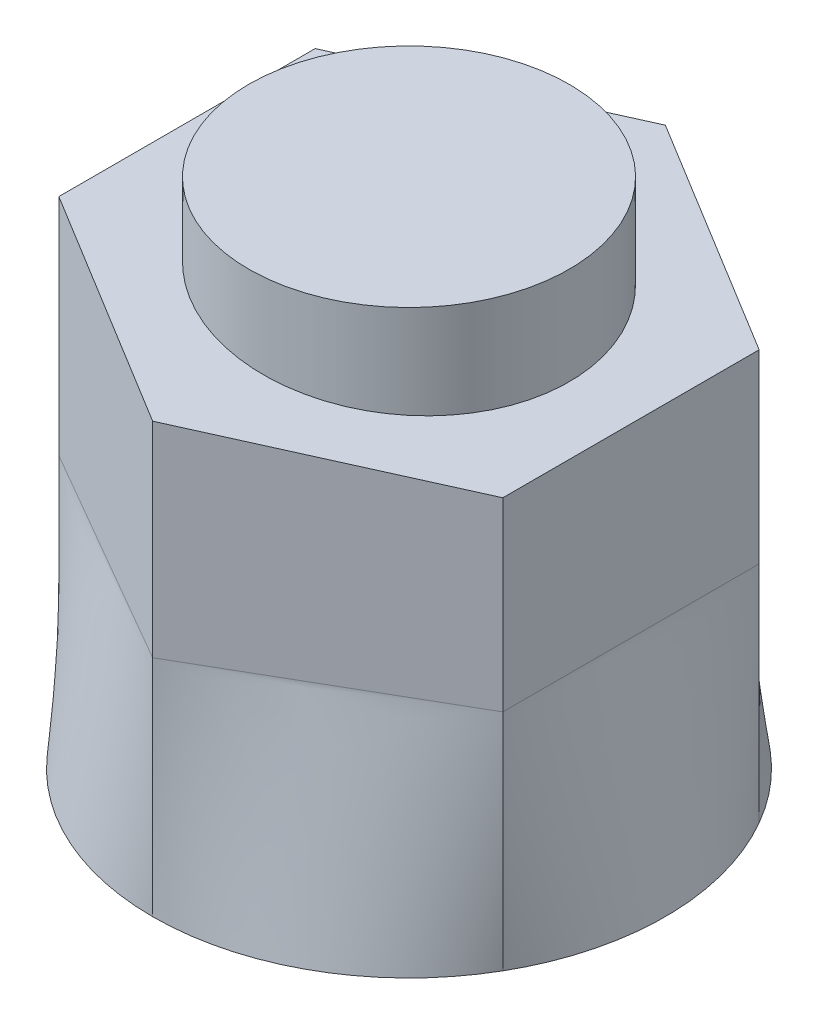
ISO-10303-21;
HEADER;
FILE_DESCRIPTION(('STEP AP214'),'2;1');
FILE_NAME('part.step','',(''),(''),'','','');
FILE_SCHEMA(('AUTOMOTIVE_DESIGN { 1 0 10303 214 1 1 1 1 }'));
ENDSEC;
DATA;
#1=APPLICATION_CONTEXT('core data for automotive mechanical design processes');
#2=APPLICATION_PROTOCOL_DEFINITION('international standard','automotive_design',2000,#1);
#3=PRODUCT_CONTEXT('',#1,'mechanical');
#4=PRODUCT('Part','Part','',(#3));
#5=PRODUCT_RELATED_PRODUCT_CATEGORY('part','',(#4));
#6=PRODUCT_DEFINITION_FORMATION('','',#4);
#7=PRODUCT_DEFINITION_CONTEXT('part definition',#1,'design');
#8=PRODUCT_DEFINITION('design','',#6,#7);
#9=PRODUCT_DEFINITION_SHAPE('','',#8);
#10=(LENGTH_UNIT() NAMED_UNIT(*) SI_UNIT(.MILLI.,.METRE.));
#11=(NAMED_UNIT(*) PLANE_ANGLE_UNIT() SI_UNIT($,.RADIAN.));
#12=(NAMED_UNIT(*) SI_UNIT($,.STERADIAN.) SOLID_ANGLE_UNIT());
#13=UNCERTAINTY_MEASURE_WITH_UNIT(LENGTH_MEASURE(1.E-05),#10,'distance_accuracy_value','');
#14=(GEOMETRIC_REPRESENTATION_CONTEXT(3) GLOBAL_UNCERTAINTY_ASSIGNED_CONTEXT((#13)) GLOBAL_UNIT_ASSIGNED_CONTEXT((#10,
#11,#12)) REPRESENTATION_CONTEXT('',''));
#15=CARTESIAN_POINT('',(0.,0.,0.));
#16=DIRECTION('',(0.,0.,1.));
#17=DIRECTION('',(1.,0.,0.));
#18=AXIS2_PLACEMENT_3D('',#15,#16,#17);
#19=CARTESIAN_POINT('',(0.,0.,0.));
#20=DIRECTION('',(0.,1.,0.));
#21=DIRECTION('',(0.,0.,1.));
#22=AXIS2_PLACEMENT_3D('',#19,#20,#21);
#23=PLANE('',#22);
#24=CARTESIAN_POINT('',(0.,0.,0.));
#25=DIRECTION('',(0.,1.,0.));
#26=DIRECTION('',(0.,0.,1.));
#27=AXIS2_PLACEMENT_3D('',#24,#25,#26);
#28=CIRCLE('',#27,40.);
#29=CARTESIAN_POINT('',(0.,0.,-40.));
#30=VERTEX_POINT('',#29);
#31=CARTESIAN_POINT('',(-34.6410161513775,0.,-20.));
#32=VERTEX_POINT('',#31);
#33=EDGE_CURVE('E268',#30,#32,#28,.T.);
#34=ORIENTED_EDGE('',*,*,#33,.F.);
#35=CARTESIAN_POINT('',(34.6410161513775,0.,-20.));
#36=VERTEX_POINT('',#35);
#37=EDGE_CURVE('E202',#36,#30,#28,.T.);
#38=ORIENTED_EDGE('',*,*,#37,.F.);
#39=CARTESIAN_POINT('',(34.6410161513775,0.,20.));
#40=VERTEX_POINT('',#39);
#41=EDGE_CURVE('E184',#40,#36,#28,.T.);
#42=ORIENTED_EDGE('',*,*,#41,.F.);
#43=CARTESIAN_POINT('',(0.,0.,40.));
#44=VERTEX_POINT('',#43);
#45=EDGE_CURVE('E170',#44,#40,#28,.T.);
#46=ORIENTED_EDGE('',*,*,#45,.F.);
#47=CARTESIAN_POINT('',(-34.6410161513776,0.,20.));
#48=VERTEX_POINT('',#47);
#49=EDGE_CURVE('E183',#48,#44,#28,.T.);
#50=ORIENTED_EDGE('',*,*,#49,.F.);
#51=EDGE_CURVE('E258',#32,#48,#28,.T.);
#52=ORIENTED_EDGE('',*,*,#51,.F.);
#53=EDGE_LOOP('',(#34,#38,#42,#46,#50,#52));
#54=FACE_BOUND('',#53,.T.);
#55=ADVANCED_FACE('F89',(#54),#23,.F.);
#56=CARTESIAN_POINT('',(-34.6410161513776,0.,20.));
#57=CARTESIAN_POINT('',(-34.6410161513776,35.0000000000002,20.));
#58=CARTESIAN_POINT('',(-33.8076828180442,0.,21.443375672974));
#59=CARTESIAN_POINT('',(-33.1976404784036,35.0000000000002,20.8333333333334));
#60=CARTESIAN_POINT('',(-32.8697219089063,0.,22.8589025007018));
#61=CARTESIAN_POINT('',(-31.7542648054295,35.0000000000002,21.6666666666667));
#62=CARTESIAN_POINT('',(-30.7900060877278,0.,25.5914744988073));
#63=CARTESIAN_POINT('',(-28.8675134594813,35.0000000000002,23.3333333333334));
#64=CARTESIAN_POINT('',(-29.6482335628825,0.,26.9083941458709));
#65=CARTESIAN_POINT('',(-27.4241377865073,35.0000000000002,24.1666666666667));
#66=CARTESIAN_POINT('',(-27.17788048915,0.,29.4013986236412));
#67=CARTESIAN_POINT('',(-24.5373864405591,35.0000000000002,25.8333333333334));
#68=CARTESIAN_POINT('',(-25.8493334557123,0.,30.5773524263481));
#69=CARTESIAN_POINT('',(-23.0940107675851,35.0000000000002,26.6666666666667));
#70=CARTESIAN_POINT('',(-23.0338534904459,0.,32.7506353356751));
#71=CARTESIAN_POINT('',(-20.2072594216369,35.0000000000001,28.3333333333334));
#72=CARTESIAN_POINT('',(-21.5470053837925,0.,33.7478521766071));
#73=CARTESIAN_POINT('',(-18.7638837486629,35.0000000000001,29.1666666666668));
#74=CARTESIAN_POINT('',(-18.4529946162075,0.,35.534180126148));
#75=CARTESIAN_POINT('',(-15.8771324027147,35.0000000000001,30.8333333333334));
#76=CARTESIAN_POINT('',(-16.8459554455521,0.,36.3232199376125));
#77=CARTESIAN_POINT('',(-14.4337567297407,35.0000000000001,31.6666666666668));
#78=CARTESIAN_POINT('',(-13.5560972538311,0.,37.6748556567158));
#79=CARTESIAN_POINT('',(-11.5470053837925,35.0000000000001,33.3333333333334));
#80=CARTESIAN_POINT('',(-11.8734178702912,0.,38.2374342364419));
#81=CARTESIAN_POINT('',(-10.1036297108185,35.0000000000001,34.1666666666668));
#82=CARTESIAN_POINT('',(-8.47923612392745,0.,39.1303205157261));
#83=CARTESIAN_POINT('',(-7.21687836487032,35.,35.8333333333334));
#84=CARTESIAN_POINT('',(-6.7678639924049,0.,39.4606647040535));
#85=CARTESIAN_POINT('',(-5.77350269189626,35.,36.6666666666668));
#86=CARTESIAN_POINT('',(-3.36152931378624,0.,39.8954654387936));
#87=CARTESIAN_POINT('',(-2.88675134594813,35.,38.3333333333334));
#88=CARTESIAN_POINT('',(-1.66666666666667,0.,40.));
#89=CARTESIAN_POINT('',(-1.44337567297407,35.,39.1666666666668));
#90=CARTESIAN_POINT('',(0.,0.,40.));
#91=CARTESIAN_POINT('',(0.,35.,40.0000000000001));
#92=B_SPLINE_SURFACE_WITH_KNOTS('',3,1,((#56,#57),(#58,#59),(#60,#61),(#62,#63),(#64,#65),(#66,
#67),(#68,#69),(#70,#71),(#72,#73),(#74,#75),(#76,#77),(#78,#79),(#80,#81),(#82,#83),(#84,#85),
(#86,#87),(#88,#89),(#90,#91)),.UNSPECIFIED.,.F.,.F.,.F.,(4,2,2,2,2,2,2,2,4),(2,2),(0.,0.125,
0.25,0.375,0.5,0.625,0.75,0.875,1.),(0.,1.),.UNSPECIFIED.);
#93=DIRECTION('',(0.,1.,0.));
#94=VECTOR('',#93,1.);
#95=CARTESIAN_POINT('',(0.,17.5,40.));
#96=LINE('',#95,#94);
#97=CARTESIAN_POINT('',(5.57628276802894E-13,35.,40.0000000000003));
#98=VERTEX_POINT('',#97);
#99=EDGE_CURVE('E177',#44,#98,#96,.T.);
#100=DIRECTION('',(-0.866025403784439,0.,-0.5));
#101=VECTOR('',#100,1.);
#102=CARTESIAN_POINT('',(0.,35.,40.0000000000001));
#103=LINE('',#102,#101);
#104=CARTESIAN_POINT('',(-34.6410161513774,35.0000000000002,20.0000000000003));
#105=VERTEX_POINT('',#104);
#106=EDGE_CURVE('E99',#98,#105,#103,.T.);
#107=DIRECTION('',(0.,-1.,0.));
#108=VECTOR('',#107,1.);
#109=CARTESIAN_POINT('',(-34.6410161513776,17.5000000000001,20.));
#110=LINE('',#109,#108);
#111=EDGE_CURVE('E279',#105,#48,#110,.T.);
#112=ORIENTED_EDGE('',*,*,#49,.T.);
#113=ORIENTED_EDGE('',*,*,#99,.T.);
#114=ORIENTED_EDGE('',*,*,#106,.T.);
#115=ORIENTED_EDGE('',*,*,#111,.T.);
#116=EDGE_LOOP('',(#112,#113,#114,#115));
#117=FACE_BOUND('',#116,.T.);
#118=ADVANCED_FACE('F221',(#117),#92,.T.);
#119=CARTESIAN_POINT('',(0.,0.,40.));
#120=CARTESIAN_POINT('',(0.,35.,40.0000000000001));
#121=CARTESIAN_POINT('',(1.66666666666667,0.,40.));
#122=CARTESIAN_POINT('',(1.44337567297407,35.,39.1666666666668));
#123=CARTESIAN_POINT('',(3.36152931378624,0.,39.8954654387936));
#124=CARTESIAN_POINT('',(2.88675134594814,35.,38.3333333333334));
#125=CARTESIAN_POINT('',(6.7678639924049,0.,39.4606647040535));
#126=CARTESIAN_POINT('',(5.77350269189627,35.,36.6666666666667));
#127=CARTESIAN_POINT('',(8.47923612392744,0.,39.1303205157261));
#128=CARTESIAN_POINT('',(7.21687836487034,35.,35.8333333333334));
#129=CARTESIAN_POINT('',(11.8734178702912,0.,38.2374342364419));
#130=CARTESIAN_POINT('',(10.1036297108185,34.9999999999999,34.1666666666667));
#131=CARTESIAN_POINT('',(13.556097253831,0.,37.6748556567158));
#132=CARTESIAN_POINT('',(11.5470053837925,34.9999999999999,33.3333333333334));
#133=CARTESIAN_POINT('',(16.845955445552,0.,36.3232199376125));
#134=CARTESIAN_POINT('',(14.4337567297407,34.9999999999999,31.6666666666668));
#135=CARTESIAN_POINT('',(18.4529946162075,0.,35.534180126148));
#136=CARTESIAN_POINT('',(15.8771324027147,34.9999999999999,30.8333333333334));
#137=CARTESIAN_POINT('',(21.5470053837925,0.,33.7478521766071));
#138=CARTESIAN_POINT('',(18.7638837486629,34.9999999999999,29.1666666666668));
#139=CARTESIAN_POINT('',(23.0338534904458,0.,32.7506353356752));
#140=CARTESIAN_POINT('',(20.2072594216369,34.9999999999999,28.3333333333334));
#141=CARTESIAN_POINT('',(25.8493334557122,0.,30.5773524263481));
#142=CARTESIAN_POINT('',(23.0940107675851,34.9999999999998,26.6666666666667));
#143=CARTESIAN_POINT('',(27.1778804891499,0.,29.4013986236413));
#144=CARTESIAN_POINT('',(24.5373864405591,34.9999999999998,25.8333333333334));
#145=CARTESIAN_POINT('',(29.6482335628825,0.,26.9083941458709));
#146=CARTESIAN_POINT('',(27.4241377865073,34.9999999999998,24.1666666666667));
#147=CARTESIAN_POINT('',(30.7900060877278,0.,25.5914744988074));
#148=CARTESIAN_POINT('',(28.8675134594813,34.9999999999998,23.3333333333334));
#149=CARTESIAN_POINT('',(32.8697219089063,0.,22.8589025007018));
#150=CARTESIAN_POINT('',(31.7542648054295,34.9999999999998,21.6666666666667));
#151=CARTESIAN_POINT('',(33.8076828180442,0.,21.4433756729741));
#152=CARTESIAN_POINT('',(33.1976404784035,34.9999999999998,20.8333333333334));
#153=CARTESIAN_POINT('',(34.6410161513775,0.,20.));
#154=CARTESIAN_POINT('',(34.6410161513776,34.9999999999998,20.0000000000001));
#155=B_SPLINE_SURFACE_WITH_KNOTS('',3,1,((#119,#120),(#121,#122),(#123,#124),(#125,#126),(#127,
#128),(#129,#130),(#131,#132),(#133,#134),(#135,#136),(#137,#138),(#139,#140),(#141,#142),(#143,
#144),(#145,#146),(#147,#148),(#149,#150),(#151,#152),(#153,#154)),.UNSPECIFIED.,.F.,.F.,.F.,(4,
2,2,2,2,2,2,2,4),(2,2),(0.,0.125,0.25,0.375000000000001,0.500000000000001,0.625000000000001,
0.75,0.875,1.),(0.,1.),.UNSPECIFIED.);
#156=DIRECTION('',(0.,1.,0.));
#157=VECTOR('',#156,1.);
#158=CARTESIAN_POINT('',(34.6410161513776,17.4999999999999,20.));
#159=LINE('',#158,#157);
#160=CARTESIAN_POINT('',(34.6410161513782,34.9999999999998,19.9999999999998));
#161=VERTEX_POINT('',#160);
#162=EDGE_CURVE('E175',#40,#161,#159,.T.);
#163=DIRECTION('',(-0.866025403784439,0.,0.5));
#164=VECTOR('',#163,1.);
#165=CARTESIAN_POINT('',(34.6410161513776,34.9999999999998,20.0000000000001));
#166=LINE('',#165,#164);
#167=EDGE_CURVE('E393',#161,#98,#166,.T.);
#168=ORIENTED_EDGE('',*,*,#45,.T.);
#169=ORIENTED_EDGE('',*,*,#162,.T.);
#170=ORIENTED_EDGE('',*,*,#167,.T.);
#171=ORIENTED_EDGE('',*,*,#99,.F.);
#172=EDGE_LOOP('',(#168,#169,#170,#171));
#173=FACE_BOUND('',#172,.T.);
#174=ADVANCED_FACE('F173',(#173),#155,.T.);
#175=CARTESIAN_POINT('',(-34.6410161513775,0.,-20.));
#176=CARTESIAN_POINT('',(-34.6410161513776,35.0000000000002,-20.));
#177=CARTESIAN_POINT('',(-35.4743494847109,0.,-18.556624327026));
#178=CARTESIAN_POINT('',(-34.6410161513776,35.0000000000002,-18.3333333333334));
#179=CARTESIAN_POINT('',(-36.2312512226925,0.,-17.0365629380919));
#180=CARTESIAN_POINT('',(-34.6410161513776,35.0000000000002,-16.6666666666667));
#181=CARTESIAN_POINT('',(-37.5578700801327,0.,-13.8691902052461));
#182=CARTESIAN_POINT('',(-34.6410161513776,35.0000000000002,-13.3333333333334));
#183=CARTESIAN_POINT('',(-38.1274696868099,0.,-12.2219263698552));
#184=CARTESIAN_POINT('',(-34.6410161513776,35.0000000000002,-11.6666666666667));
#185=CARTESIAN_POINT('',(-39.0512983594411,0.,-8.83603561280069));
#186=CARTESIAN_POINT('',(-34.6410161513776,35.0000000000002,-8.33333333333336));
#187=CARTESIAN_POINT('',(-39.4054307095433,0.,-7.09750323036778));
#188=CARTESIAN_POINT('',(-34.6410161513776,35.0000000000002,-6.66666666666669));
#189=CARTESIAN_POINT('',(-39.8798089359979,0.,-3.57258460193742));
#190=CARTESIAN_POINT('',(-34.6410161513776,35.0000000000002,-3.33333333333335));
#191=CARTESIAN_POINT('',(-40.,0.,-1.78632794954084));
#192=CARTESIAN_POINT('',(-34.6410161513776,35.0000000000002,-1.66666666666668));
#193=CARTESIAN_POINT('',(-40.,0.,1.78632794954079));
#194=CARTESIAN_POINT('',(-34.6410161513776,35.0000000000002,1.66666666666666));
#195=CARTESIAN_POINT('',(-39.8798089359979,0.,3.57258460193737));
#196=CARTESIAN_POINT('',(-34.6410161513776,35.0000000000002,3.33333333333333));
#197=CARTESIAN_POINT('',(-39.4054307095433,0.,7.09750323036773));
#198=CARTESIAN_POINT('',(-34.6410161513776,35.0000000000002,6.66666666666666));
#199=CARTESIAN_POINT('',(-39.0512983594411,0.,8.83603561280064));
#200=CARTESIAN_POINT('',(-34.6410161513776,35.0000000000002,8.33333333333333));
#201=CARTESIAN_POINT('',(-38.1274696868099,0.,12.2219263698552));
#202=CARTESIAN_POINT('',(-34.6410161513776,35.0000000000002,11.6666666666667));
#203=CARTESIAN_POINT('',(-37.5578700801327,0.,13.8691902052461));
#204=CARTESIAN_POINT('',(-34.6410161513776,35.0000000000002,13.3333333333333));
#205=CARTESIAN_POINT('',(-36.2312512226925,0.,17.0365629380918));
#206=CARTESIAN_POINT('',(-34.6410161513776,35.0000000000002,16.6666666666667));
#207=CARTESIAN_POINT('',(-35.4743494847109,0.,18.5566243270259));
#208=CARTESIAN_POINT('',(-34.6410161513776,35.0000000000002,18.3333333333334));
#209=CARTESIAN_POINT('',(-34.6410161513776,0.,20.));
#210=CARTESIAN_POINT('',(-34.6410161513776,35.0000000000002,20.));
#211=B_SPLINE_SURFACE_WITH_KNOTS('',3,1,((#175,#176),(#177,#178),(#179,#180),(#181,#182),(#183,
#184),(#185,#186),(#187,#188),(#189,#190),(#191,#192),(#193,#194),(#195,#196),(#197,#198),(#199,
#200),(#201,#202),(#203,#204),(#205,#206),(#207,#208),(#209,#210)),.UNSPECIFIED.,.F.,.F.,.F.,(4,
2,2,2,2,2,2,2,4),(2,2),(0.,0.125,0.25,0.375,0.5,0.625,0.75,0.875,1.),(0.,1.),.UNSPECIFIED.);
#212=DIRECTION('',(0.,0.,-1.));
#213=VECTOR('',#212,1.);
#214=CARTESIAN_POINT('',(-34.6410161513776,35.0000000000002,20.));
#215=LINE('',#214,#213);
#216=CARTESIAN_POINT('',(-34.6410161513776,35.0000000000002,-20.));
#217=VERTEX_POINT('',#216);
#218=EDGE_CURVE('E328',#105,#217,#215,.T.);
#219=DIRECTION('',(0.,1.,0.));
#220=VECTOR('',#219,1.);
#221=CARTESIAN_POINT('',(-34.6410161513776,17.5000000000001,-20.));
#222=LINE('',#221,#220);
#223=EDGE_CURVE('E368',#32,#217,#222,.T.);
#224=ORIENTED_EDGE('',*,*,#51,.T.);
#225=ORIENTED_EDGE('',*,*,#111,.F.);
#226=ORIENTED_EDGE('',*,*,#218,.T.);
#227=ORIENTED_EDGE('',*,*,#223,.F.);
#228=EDGE_LOOP('',(#224,#225,#226,#227));
#229=FACE_BOUND('',#228,.T.);
#230=ADVANCED_FACE('F293',(#229),#211,.T.);
#231=CARTESIAN_POINT('',(34.6410161513775,0.,20.));
#232=CARTESIAN_POINT('',(34.6410161513776,34.9999999999998,20.0000000000001));
#233=CARTESIAN_POINT('',(35.4743494847109,0.,18.556624327026));
#234=CARTESIAN_POINT('',(34.6410161513776,34.9999999999998,18.3333333333334));
#235=CARTESIAN_POINT('',(36.2312512226925,0.,17.0365629380919));
#236=CARTESIAN_POINT('',(34.6410161513776,34.9999999999998,16.6666666666667));
#237=CARTESIAN_POINT('',(37.5578700801327,0.,13.8691902052461));
#238=CARTESIAN_POINT('',(34.6410161513776,34.9999999999998,13.3333333333334));
#239=CARTESIAN_POINT('',(38.1274696868099,0.,12.2219263698552));
#240=CARTESIAN_POINT('',(34.6410161513776,34.9999999999998,11.6666666666667));
#241=CARTESIAN_POINT('',(39.0512983594411,0.,8.83603561280069));
#242=CARTESIAN_POINT('',(34.6410161513776,34.9999999999998,8.33333333333341));
#243=CARTESIAN_POINT('',(39.4054307095433,0.,7.09750323036777));
#244=CARTESIAN_POINT('',(34.6410161513776,34.9999999999998,6.66666666666674));
#245=CARTESIAN_POINT('',(39.8798089359979,0.,3.57258460193741));
#246=CARTESIAN_POINT('',(34.6410161513776,34.9999999999998,3.3333333333334));
#247=CARTESIAN_POINT('',(40.,0.,1.78632794954083));
#248=CARTESIAN_POINT('',(34.6410161513776,34.9999999999998,1.66666666666673));
#249=CARTESIAN_POINT('',(40.,0.,-1.7863279495408));
#250=CARTESIAN_POINT('',(34.6410161513776,34.9999999999998,-1.66666666666662));
#251=CARTESIAN_POINT('',(39.8798089359979,0.,-3.57258460193738));
#252=CARTESIAN_POINT('',(34.6410161513776,34.9999999999998,-3.33333333333328));
#253=CARTESIAN_POINT('',(39.4054307095433,0.,-7.09750323036774));
#254=CARTESIAN_POINT('',(34.6410161513776,34.9999999999998,-6.66666666666663));
#255=CARTESIAN_POINT('',(39.0512983594411,0.,-8.83603561280066));
#256=CARTESIAN_POINT('',(34.6410161513776,34.9999999999998,-8.3333333333333));
#257=CARTESIAN_POINT('',(38.1274696868099,0.,-12.2219263698552));
#258=CARTESIAN_POINT('',(34.6410161513776,34.9999999999998,-11.6666666666666));
#259=CARTESIAN_POINT('',(37.5578700801327,0.,-13.8691902052461));
#260=CARTESIAN_POINT('',(34.6410161513776,34.9999999999998,-13.3333333333333));
#261=CARTESIAN_POINT('',(36.2312512226925,0.,-17.0365629380919));
#262=CARTESIAN_POINT('',(34.6410161513776,34.9999999999998,-16.6666666666667));
#263=CARTESIAN_POINT('',(35.4743494847109,0.,-18.5566243270259));
#264=CARTESIAN_POINT('',(34.6410161513776,34.9999999999998,-18.3333333333333));
#265=CARTESIAN_POINT('',(34.6410161513775,0.,-20.));
#266=CARTESIAN_POINT('',(34.6410161513776,34.9999999999998,-20.));
#267=B_SPLINE_SURFACE_WITH_KNOTS('',3,1,((#231,#232),(#233,#234),(#235,#236),(#237,#238),(#239,
#240),(#241,#242),(#243,#244),(#245,#246),(#247,#248),(#249,#250),(#251,#252),(#253,#254),(#255,
#256),(#257,#258),(#259,#260),(#261,#262),(#263,#264),(#265,#266)),.UNSPECIFIED.,.F.,.F.,.F.,(4,
2,2,2,2,2,2,2,4),(2,2),(0.,0.125,0.25,0.375,0.5,0.625,0.75,0.875,1.),(0.,1.),.UNSPECIFIED.);
#268=DIRECTION('',(0.,1.,0.));
#269=VECTOR('',#268,1.);
#270=CARTESIAN_POINT('',(34.6410161513776,17.4999999999999,-20.));
#271=LINE('',#270,#269);
#272=CARTESIAN_POINT('',(34.6410161513778,34.9999999999998,-20.0000000000006));
#273=VERTEX_POINT('',#272);
#274=EDGE_CURVE('E197',#36,#273,#271,.T.);
#275=DIRECTION('',(0.,0.,1.));
#276=VECTOR('',#275,1.);
#277=CARTESIAN_POINT('',(34.6410161513776,34.9999999999998,-20.));
#278=LINE('',#277,#276);
#279=EDGE_CURVE('E194',#273,#161,#278,.T.);
#280=ORIENTED_EDGE('',*,*,#41,.T.);
#281=ORIENTED_EDGE('',*,*,#274,.T.);
#282=ORIENTED_EDGE('',*,*,#279,.T.);
#283=ORIENTED_EDGE('',*,*,#162,.F.);
#284=EDGE_LOOP('',(#280,#281,#282,#283));
#285=FACE_BOUND('',#284,.T.);
#286=ADVANCED_FACE('F190',(#285),#267,.T.);
#287=CARTESIAN_POINT('',(34.6410161513775,0.,-20.));
#288=CARTESIAN_POINT('',(34.6410161513776,34.9999999999998,-20.));
#289=CARTESIAN_POINT('',(33.8076828180442,0.,-21.4433756729741));
#290=CARTESIAN_POINT('',(33.1976404784035,34.9999999999998,-20.8333333333334));
#291=CARTESIAN_POINT('',(32.8697219089063,0.,-22.8589025007018));
#292=CARTESIAN_POINT('',(31.7542648054295,34.9999999999998,-21.6666666666667));
#293=CARTESIAN_POINT('',(30.7900060877278,0.,-25.5914744988073));
#294=CARTESIAN_POINT('',(28.8675134594813,34.9999999999998,-23.3333333333334));
#295=CARTESIAN_POINT('',(29.6482335628825,0.,-26.9083941458709));
#296=CARTESIAN_POINT('',(27.4241377865073,34.9999999999998,-24.1666666666667));
#297=CARTESIAN_POINT('',(27.1778804891499,0.,-29.4013986236412));
#298=CARTESIAN_POINT('',(24.5373864405591,34.9999999999998,-25.8333333333334));
#299=CARTESIAN_POINT('',(25.8493334557122,0.,-30.5773524263481));
#300=CARTESIAN_POINT('',(23.0940107675851,34.9999999999998,-26.6666666666667));
#301=CARTESIAN_POINT('',(23.0338534904458,0.,-32.7506353356751));
#302=CARTESIAN_POINT('',(20.2072594216369,34.9999999999999,-28.3333333333334));
#303=CARTESIAN_POINT('',(21.5470053837925,0.,-33.7478521766071));
#304=CARTESIAN_POINT('',(18.7638837486628,34.9999999999999,-29.1666666666667));
#305=CARTESIAN_POINT('',(18.4529946162075,0.,-35.534180126148));
#306=CARTESIAN_POINT('',(15.8771324027147,34.9999999999999,-30.8333333333334));
#307=CARTESIAN_POINT('',(16.8459554455521,0.,-36.3232199376125));
#308=CARTESIAN_POINT('',(14.4337567297406,34.9999999999999,-31.6666666666667));
#309=CARTESIAN_POINT('',(13.5560972538311,0.,-37.6748556567158));
#310=CARTESIAN_POINT('',(11.5470053837925,34.9999999999999,-33.3333333333334));
#311=CARTESIAN_POINT('',(11.8734178702912,0.,-38.2374342364419));
#312=CARTESIAN_POINT('',(10.1036297108185,34.9999999999999,-34.1666666666667));
#313=CARTESIAN_POINT('',(8.47923612392744,0.,-39.1303205157261));
#314=CARTESIAN_POINT('',(7.21687836487032,35.,-35.8333333333334));
#315=CARTESIAN_POINT('',(6.76786399240491,0.,-39.4606647040535));
#316=CARTESIAN_POINT('',(5.77350269189626,35.,-36.6666666666667));
#317=CARTESIAN_POINT('',(3.36152931378624,0.,-39.8954654387936));
#318=CARTESIAN_POINT('',(2.88675134594813,35.,-38.3333333333334));
#319=CARTESIAN_POINT('',(1.66666666666667,0.,-40.));
#320=CARTESIAN_POINT('',(1.44337567297407,35.,-39.1666666666667));
#321=CARTESIAN_POINT('',(0.,0.,-40.));
#322=CARTESIAN_POINT('',(0.,35.,-40.0000000000001));
#323=B_SPLINE_SURFACE_WITH_KNOTS('',3,1,((#287,#288),(#289,#290),(#291,#292),(#293,#294),(#295,
#296),(#297,#298),(#299,#300),(#301,#302),(#303,#304),(#305,#306),(#307,#308),(#309,#310),(#311,
#312),(#313,#314),(#315,#316),(#317,#318),(#319,#320),(#321,#322)),.UNSPECIFIED.,.F.,.F.,.F.,(4,
2,2,2,2,2,2,2,4),(2,2),(0.,0.125,0.25,0.375,0.5,0.625,0.75,0.875,1.),(0.,1.),.UNSPECIFIED.);
#324=DIRECTION('',(0.,1.,0.));
#325=VECTOR('',#324,1.);
#326=CARTESIAN_POINT('',(0.,17.5,-40.));
#327=LINE('',#326,#325);
#328=CARTESIAN_POINT('',(0.,35.,-40.0000000000001));
#329=VERTEX_POINT('',#328);
#330=EDGE_CURVE('E359',#30,#329,#327,.T.);
#331=DIRECTION('',(0.866025403784438,0.,0.5));
#332=VECTOR('',#331,1.);
#333=CARTESIAN_POINT('',(0.,35.,-40.0000000000001));
#334=LINE('',#333,#332);
#335=EDGE_CURVE('E418',#329,#273,#334,.T.);
#336=ORIENTED_EDGE('',*,*,#37,.T.);
#337=ORIENTED_EDGE('',*,*,#330,.T.);
#338=ORIENTED_EDGE('',*,*,#335,.T.);
#339=ORIENTED_EDGE('',*,*,#274,.F.);
#340=EDGE_LOOP('',(#336,#337,#338,#339));
#341=FACE_BOUND('',#340,.T.);
#342=ADVANCED_FACE('F345',(#341),#323,.T.);
#343=CARTESIAN_POINT('',(0.,0.,-40.));
#344=CARTESIAN_POINT('',(0.,35.,-40.0000000000001));
#345=CARTESIAN_POINT('',(-1.66666666666666,0.,-40.));
#346=CARTESIAN_POINT('',(-1.44337567297406,35.,-39.1666666666667));
#347=CARTESIAN_POINT('',(-3.36152931378623,0.,-39.8954654387936));
#348=CARTESIAN_POINT('',(-2.88675134594813,35.,-38.3333333333334));
#349=CARTESIAN_POINT('',(-6.7678639924049,0.,-39.4606647040535));
#350=CARTESIAN_POINT('',(-5.77350269189628,35.,-36.6666666666667));
#351=CARTESIAN_POINT('',(-8.47923612392743,0.,-39.1303205157261));
#352=CARTESIAN_POINT('',(-7.21687836487034,35.,-35.8333333333334));
#353=CARTESIAN_POINT('',(-11.8734178702912,0.,-38.2374342364419));
#354=CARTESIAN_POINT('',(-10.1036297108185,35.0000000000001,-34.1666666666667));
#355=CARTESIAN_POINT('',(-13.556097253831,0.,-37.6748556567158));
#356=CARTESIAN_POINT('',(-11.5470053837926,35.0000000000001,-33.3333333333334));
#357=CARTESIAN_POINT('',(-16.845955445552,0.,-36.3232199376125));
#358=CARTESIAN_POINT('',(-14.4337567297407,35.0000000000001,-31.6666666666667));
#359=CARTESIAN_POINT('',(-18.4529946162075,0.,-35.534180126148));
#360=CARTESIAN_POINT('',(-15.8771324027148,35.0000000000001,-30.8333333333334));
#361=CARTESIAN_POINT('',(-21.5470053837925,0.,-33.7478521766072));
#362=CARTESIAN_POINT('',(-18.7638837486629,35.0000000000001,-29.1666666666667));
#363=CARTESIAN_POINT('',(-23.0338534904458,0.,-32.7506353356752));
#364=CARTESIAN_POINT('',(-20.207259421637,35.0000000000001,-28.3333333333334));
#365=CARTESIAN_POINT('',(-25.8493334557122,0.,-30.5773524263481));
#366=CARTESIAN_POINT('',(-23.0940107675851,35.0000000000002,-26.6666666666667));
#367=CARTESIAN_POINT('',(-27.1778804891499,0.,-29.4013986236413));
#368=CARTESIAN_POINT('',(-24.5373864405592,35.0000000000002,-25.8333333333334));
#369=CARTESIAN_POINT('',(-29.6482335628825,0.,-26.9083941458709));
#370=CARTESIAN_POINT('',(-27.4241377865073,35.0000000000002,-24.1666666666667));
#371=CARTESIAN_POINT('',(-30.7900060877278,0.,-25.5914744988074));
#372=CARTESIAN_POINT('',(-28.8675134594814,35.0000000000002,-23.3333333333334));
#373=CARTESIAN_POINT('',(-32.8697219089063,0.,-22.8589025007018));
#374=CARTESIAN_POINT('',(-31.7542648054295,35.0000000000002,-21.6666666666667));
#375=CARTESIAN_POINT('',(-33.8076828180442,0.,-21.4433756729741));
#376=CARTESIAN_POINT('',(-33.1976404784036,35.0000000000002,-20.8333333333334));
#377=CARTESIAN_POINT('',(-34.6410161513775,0.,-20.));
#378=CARTESIAN_POINT('',(-34.6410161513776,35.0000000000002,-20.));
#379=B_SPLINE_SURFACE_WITH_KNOTS('',3,1,((#343,#344),(#345,#346),(#347,#348),(#349,#350),(#351,
#352),(#353,#354),(#355,#356),(#357,#358),(#359,#360),(#361,#362),(#363,#364),(#365,#366),(#367,
#368),(#369,#370),(#371,#372),(#373,#374),(#375,#376),(#377,#378)),.UNSPECIFIED.,.F.,.F.,.F.,(4,
2,2,2,2,2,2,2,4),(2,2),(0.,0.125,0.25,0.375000000000001,0.500000000000001,0.625000000000001,
0.750000000000001,0.875,1.),(0.,1.),.UNSPECIFIED.);
#380=DIRECTION('',(0.866025403784439,0.,-0.5));
#381=VECTOR('',#380,1.);
#382=CARTESIAN_POINT('',(-34.6410161513776,35.0000000000002,-20.));
#383=LINE('',#382,#381);
#384=EDGE_CURVE('E431',#217,#329,#383,.T.);
#385=ORIENTED_EDGE('',*,*,#33,.T.);
#386=ORIENTED_EDGE('',*,*,#223,.T.);
#387=ORIENTED_EDGE('',*,*,#384,.T.);
#388=ORIENTED_EDGE('',*,*,#330,.F.);
#389=EDGE_LOOP('',(#385,#386,#387,#388));
#390=FACE_BOUND('',#389,.T.);
#391=ADVANCED_FACE('F335',(#390),#379,.T.);
#392=CARTESIAN_POINT('',(-1.05988773481884E-13,70.,-40.0000000000003));
#393=DIRECTION('',(0.500000000000008,0.,0.866025403784434));
#394=DIRECTION('',(0.866025403784434,0.,-0.500000000000008));
#395=AXIS2_PLACEMENT_3D('',#392,#393,#394);
#396=PLANE('',#395);
#397=ORIENTED_EDGE('',*,*,#384,.F.);
#398=DIRECTION('',(0.,-1.,0.));
#399=VECTOR('',#398,1.);
#400=CARTESIAN_POINT('',(-34.6410161513774,70.0000000000003,-20.));
#401=LINE('',#400,#399);
#402=CARTESIAN_POINT('',(-34.6410161513774,70.0000000000003,-20.));
#403=VERTEX_POINT('',#402);
#404=EDGE_CURVE('E515',#403,#217,#401,.T.);
#405=ORIENTED_EDGE('',*,*,#404,.F.);
#406=DIRECTION('',(-0.863550259614418,0.0755508581011335,0.498570974847166));
#407=VECTOR('',#406,1.);
#408=CARTESIAN_POINT('',(-0.197728570139303,66.9866028020786,-39.885841356804));
#409=LINE('',#408,#407);
#410=CARTESIAN_POINT('',(-1.27236382871919E-13,66.9693037937362,-40.0000000000003));
#411=VERTEX_POINT('',#410);
#412=EDGE_CURVE('E443',#411,#403,#409,.T.);
#413=ORIENTED_EDGE('',*,*,#412,.F.);
#414=DIRECTION('',(0.,-1.,0.));
#415=VECTOR('',#414,1.);
#416=CARTESIAN_POINT('',(-1.05988773481884E-13,70.,-40.0000000000003));
#417=LINE('',#416,#415);
#418=EDGE_CURVE('E107',#411,#329,#417,.T.);
#419=ORIENTED_EDGE('',*,*,#418,.T.);
#420=EDGE_LOOP('',(#397,#405,#413,#419));
#421=FACE_BOUND('',#420,.T.);
#422=ADVANCED_FACE('F222',(#421),#396,.F.);
#423=CARTESIAN_POINT('',(-34.6410161513774,70.0000000000003,-20.));
#424=DIRECTION('',(1.,0.,0.));
#425=DIRECTION('',(0.,1.,0.));
#426=AXIS2_PLACEMENT_3D('',#423,#424,#425);
#427=PLANE('',#426);
#428=ORIENTED_EDGE('',*,*,#218,.F.);
#429=DIRECTION('',(0.,-1.,0.));
#430=VECTOR('',#429,1.);
#431=CARTESIAN_POINT('',(-34.6410161513772,70.0000000000003,20.0000000000003));
#432=LINE('',#431,#430);
#433=CARTESIAN_POINT('',(-34.6410161513772,70.0000000000003,20.0000000000003));
#434=VERTEX_POINT('',#433);
#435=EDGE_CURVE('E463',#434,#105,#432,.T.);
#436=ORIENTED_EDGE('',*,*,#435,.F.);
#437=DIRECTION('',(0.,0.,1.));
#438=VECTOR('',#437,1.);
#439=CARTESIAN_POINT('',(-34.6410161513774,70.0000000000003,-20.));
#440=LINE('',#439,#438);
#441=EDGE_CURVE('E136',#403,#434,#440,.T.);
#442=ORIENTED_EDGE('',*,*,#441,.F.);
#443=ORIENTED_EDGE('',*,*,#404,.T.);
#444=EDGE_LOOP('',(#428,#436,#442,#443));
#445=FACE_BOUND('',#444,.T.);
#446=ADVANCED_FACE('F465',(#445),#427,.F.);
#447=CARTESIAN_POINT('',(-34.6410161513772,70.0000000000003,20.0000000000003));
#448=DIRECTION('',(0.499999999999994,0.,-0.866025403784442));
#449=DIRECTION('',(-0.866025403784442,0.,-0.499999999999994));
#450=AXIS2_PLACEMENT_3D('',#447,#448,#449);
#451=PLANE('',#450);
#452=ORIENTED_EDGE('',*,*,#106,.F.);
#453=DIRECTION('',(0.,-1.,0.));
#454=VECTOR('',#453,1.);
#455=CARTESIAN_POINT('',(8.03006327929963E-13,70.,40.0000000000003));
#456=LINE('',#455,#454);
#457=CARTESIAN_POINT('',(7.81758718539928E-13,66.9693037937361,40.0000000000003));
#458=VERTEX_POINT('',#457);
#459=EDGE_CURVE('E488',#458,#98,#456,.T.);
#460=ORIENTED_EDGE('',*,*,#459,.F.);
#461=DIRECTION('',(0.863550259614426,-0.0755508581011338,0.498570974847153));
#462=VECTOR('',#461,1.);
#463=CARTESIAN_POINT('',(-34.6410161513772,70.0000000000003,20.0000000000003));
#464=LINE('',#463,#462);
#465=EDGE_CURVE('E130',#434,#458,#464,.T.);
#466=ORIENTED_EDGE('',*,*,#465,.F.);
#467=ORIENTED_EDGE('',*,*,#435,.T.);
#468=EDGE_LOOP('',(#452,#460,#466,#467));
#469=FACE_BOUND('',#468,.T.);
#470=ADVANCED_FACE('F474',(#469),#451,.F.);
#471=CARTESIAN_POINT('',(8.03006327929963E-13,70.,40.0000000000003));
#472=DIRECTION('',(-0.500000000000008,0.,-0.866025403784434));
#473=DIRECTION('',(-0.866025403784434,0.,0.500000000000008));
#474=AXIS2_PLACEMENT_3D('',#471,#472,#473);
#475=PLANE('',#474);
#476=ORIENTED_EDGE('',*,*,#167,.F.);
#477=DIRECTION('',(0.,-1.,0.));
#478=VECTOR('',#477,1.);
#479=CARTESIAN_POINT('',(34.6410161513785,69.9999999999998,19.9999999999998));
#480=LINE('',#479,#478);
#481=CARTESIAN_POINT('',(34.6410161513784,63.938607587472,19.9999999999998));
#482=VERTEX_POINT('',#481);
#483=EDGE_CURVE('E497',#482,#161,#480,.T.);
#484=ORIENTED_EDGE('',*,*,#483,.F.);
#485=DIRECTION('',(0.863550259614418,-0.0755508581011335,-0.498570974847166));
#486=VECTOR('',#485,1.);
#487=CARTESIAN_POINT('',(-0.197728570138397,66.9866028020785,40.1141586431966));
#488=LINE('',#487,#486);
#489=EDGE_CURVE('E125',#458,#482,#488,.T.);
#490=ORIENTED_EDGE('',*,*,#489,.F.);
#491=ORIENTED_EDGE('',*,*,#459,.T.);
#492=EDGE_LOOP('',(#476,#484,#490,#491));
#493=FACE_BOUND('',#492,.T.);
#494=ADVANCED_FACE('F478',(#493),#475,.F.);
#495=CARTESIAN_POINT('',(34.6410161513785,69.9999999999998,19.9999999999998));
#496=DIRECTION('',(-1.,0.,0.));
#497=DIRECTION('',(0.,0.,1.));
#498=AXIS2_PLACEMENT_3D('',#495,#496,#497);
#499=PLANE('',#498);
#500=ORIENTED_EDGE('',*,*,#279,.F.);
#501=DIRECTION('',(0.,-1.,0.));
#502=VECTOR('',#501,1.);
#503=CARTESIAN_POINT('',(34.641016151378,69.9999999999998,-20.0000000000006));
#504=LINE('',#503,#502);
#505=CARTESIAN_POINT('',(34.641016151378,63.938607587472,-20.0000000000006));
#506=VERTEX_POINT('',#505);
#507=EDGE_CURVE('E520',#506,#273,#504,.T.);
#508=ORIENTED_EDGE('',*,*,#507,.F.);
#509=DIRECTION('',(0.,0.,-1.));
#510=VECTOR('',#509,1.);
#511=CARTESIAN_POINT('',(34.6410161513784,63.938607587472,19.9999999999998));
#512=LINE('',#511,#510);
#513=EDGE_CURVE('E527',#482,#506,#512,.T.);
#514=ORIENTED_EDGE('',*,*,#513,.F.);
#515=ORIENTED_EDGE('',*,*,#483,.T.);
#516=EDGE_LOOP('',(#500,#508,#514,#515));
#517=FACE_BOUND('',#516,.T.);
#518=ADVANCED_FACE('F554',(#517),#499,.F.);
#519=CARTESIAN_POINT('',(34.641016151378,69.9999999999998,-20.0000000000006));
#520=DIRECTION('',(-0.499999999999988,0.,0.866025403784446));
#521=DIRECTION('',(0.866025403784446,0.,0.499999999999988));
#522=AXIS2_PLACEMENT_3D('',#519,#520,#521);
#523=PLANE('',#522);
#524=ORIENTED_EDGE('',*,*,#335,.F.);
#525=ORIENTED_EDGE('',*,*,#418,.F.);
#526=DIRECTION('',(-0.863550259614429,0.0755508581011341,-0.498570974847146));
#527=VECTOR('',#526,1.);
#528=CARTESIAN_POINT('',(34.2455590110996,63.9732056041568,-20.2283172863932));
#529=LINE('',#528,#527);
#530=EDGE_CURVE('E525',#506,#411,#529,.T.);
#531=ORIENTED_EDGE('',*,*,#530,.F.);
#532=ORIENTED_EDGE('',*,*,#507,.T.);
#533=EDGE_LOOP('',(#524,#525,#531,#532));
#534=FACE_BOUND('',#533,.T.);
#535=ADVANCED_FACE('F550',(#534),#523,.F.);
#536=CARTESIAN_POINT('',(-34.6410161513774,70.0000000000003,-20.));
#537=DIRECTION('',(0.0871557427476618,0.996194698091745,0.));
#538=DIRECTION('',(-0.996194698091745,0.0871557427476618,0.));
#539=AXIS2_PLACEMENT_3D('',#536,#537,#538);
#540=PLANE('',#539);
#541=CARTESIAN_POINT('',(4.69508492864106E-13,66.9693037937361,0.));
#542=DIRECTION('',(0.0871557427476618,0.996194698091745,0.));
#543=DIRECTION('',(-0.996194698091745,0.0871557427476618,0.));
#544=AXIS2_PLACEMENT_3D('',#541,#542,#543);
#545=ELLIPSE('',#544,25.0954959385837,25.);
#546=CARTESIAN_POINT('',(-24.9999999999995,69.1565203818843,1.12757025938489E-13));
#547=VERTEX_POINT('',#546);
#548=EDGE_CURVE('E12',#547,#547,#545,.T.);
#549=ORIENTED_EDGE('',*,*,#548,.F.);
#550=EDGE_LOOP('',(#549));
#551=FACE_BOUND('',#550,.T.);
#552=ORIENTED_EDGE('',*,*,#412,.T.);
#553=ORIENTED_EDGE('',*,*,#441,.T.);
#554=ORIENTED_EDGE('',*,*,#465,.T.);
#555=ORIENTED_EDGE('',*,*,#489,.T.);
#556=ORIENTED_EDGE('',*,*,#513,.T.);
#557=ORIENTED_EDGE('',*,*,#530,.T.);
#558=EDGE_LOOP('',(#552,#553,#554,#555,#556,#557));
#559=FACE_BOUND('',#558,.T.);
#560=ADVANCED_FACE('F91',(#551,#559),#540,.T.);
#561=CARTESIAN_POINT('',(4.20648087646407E-13,60.,0.));
#562=DIRECTION('',(0.,1.,0.));
#563=DIRECTION('',(-1.,0.,0.));
#564=AXIS2_PLACEMENT_3D('',#561,#562,#563);
#565=CYLINDRICAL_SURFACE('',#564,25.);
#566=ORIENTED_EDGE('',*,*,#548,.T.);
#567=EDGE_LOOP('',(#566));
#568=FACE_BOUND('',#567,.T.);
#569=CARTESIAN_POINT('',(5.60864116861876E-13,80.,0.));
#570=DIRECTION('',(0.,1.,0.));
#571=DIRECTION('',(-1.,0.,0.));
#572=AXIS2_PLACEMENT_3D('',#569,#570,#571);
#573=CIRCLE('',#572,25.);
#574=CARTESIAN_POINT('',(-24.9999999999994,80.0000000000002,0.));
#575=VERTEX_POINT('',#574);
#576=EDGE_CURVE('E535',#575,#575,#573,.T.);
#577=ORIENTED_EDGE('',*,*,#576,.F.);
#578=EDGE_LOOP('',(#577));
#579=FACE_BOUND('',#578,.T.);
#580=ADVANCED_FACE('F541',(#568,#579),#565,.T.);
#581=CARTESIAN_POINT('',(5.60864116861876E-13,80.,0.));
#582=DIRECTION('',(0.,1.,0.));
#583=DIRECTION('',(-1.,0.,0.));
#584=AXIS2_PLACEMENT_3D('',#581,#582,#583);
#585=PLANE('',#584);
#586=ORIENTED_EDGE('',*,*,#576,.T.);
#587=EDGE_LOOP('',(#586));
#588=FACE_BOUND('',#587,.T.);
#589=ADVANCED_FACE('F539',(#588),#585,.T.);
#590=CLOSED_SHELL('',(#55,#118,#174,#230,#286,#342,#391,#422,#446,#470,#494,#518,#535,#560,#580,#589));
#591=MANIFOLD_SOLID_BREP('B2',#590);
#592=ADVANCED_BREP_SHAPE_REPRESENTATION('',(#18,#591),#14);
#593=SHAPE_DEFINITION_REPRESENTATION(#9,#592);
ENDSEC;
END-ISO-10303-21;
